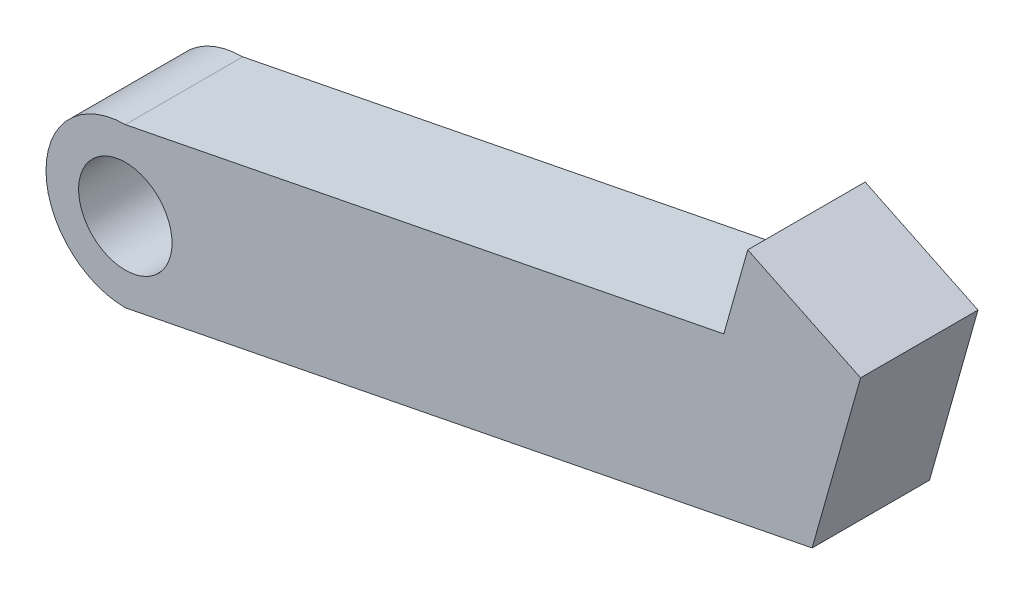
ISO-10303-21;
HEADER;
FILE_DESCRIPTION(('STEP AP214'),'2;1');
FILE_NAME('part.step','',(''),(''),'','','');
FILE_SCHEMA(('AUTOMOTIVE_DESIGN { 1 0 10303 214 1 1 1 1 }'));
ENDSEC;
DATA;
#1=APPLICATION_CONTEXT('core data for automotive mechanical design processes');
#2=APPLICATION_PROTOCOL_DEFINITION('international standard','automotive_design',2000,#1);
#3=PRODUCT_CONTEXT('',#1,'mechanical');
#4=PRODUCT('Part','Part','',(#3));
#5=PRODUCT_RELATED_PRODUCT_CATEGORY('part','',(#4));
#6=PRODUCT_DEFINITION_FORMATION('','',#4);
#7=PRODUCT_DEFINITION_CONTEXT('part definition',#1,'design');
#8=PRODUCT_DEFINITION('design','',#6,#7);
#9=PRODUCT_DEFINITION_SHAPE('','',#8);
#10=(LENGTH_UNIT() NAMED_UNIT(*) SI_UNIT(.MILLI.,.METRE.));
#11=(NAMED_UNIT(*) PLANE_ANGLE_UNIT() SI_UNIT($,.RADIAN.));
#12=(NAMED_UNIT(*) SI_UNIT($,.STERADIAN.) SOLID_ANGLE_UNIT());
#13=UNCERTAINTY_MEASURE_WITH_UNIT(LENGTH_MEASURE(1.E-05),#10,'distance_accuracy_value','');
#14=(GEOMETRIC_REPRESENTATION_CONTEXT(3) GLOBAL_UNCERTAINTY_ASSIGNED_CONTEXT((#13)) GLOBAL_UNIT_ASSIGNED_CONTEXT((#10,
#11,#12)) REPRESENTATION_CONTEXT('',''));
#15=CARTESIAN_POINT('',(0.,0.,0.));
#16=DIRECTION('',(0.,0.,1.));
#17=DIRECTION('',(1.,0.,0.));
#18=AXIS2_PLACEMENT_3D('',#15,#16,#17);
#19=CARTESIAN_POINT('',(0.,0.,8.4582));
#20=DIRECTION('',(0.,0.,1.));
#21=DIRECTION('',(1.,0.,0.));
#22=AXIS2_PLACEMENT_3D('',#19,#20,#21);
#23=PLANE('',#22);
#24=CARTESIAN_POINT('',(0.,0.,8.4582));
#25=DIRECTION('',(0.,0.,1.));
#26=DIRECTION('',(1.,0.,0.));
#27=AXIS2_PLACEMENT_3D('',#24,#25,#26);
#28=CIRCLE('',#27,5.715);
#29=CARTESIAN_POINT('',(0.,5.715,8.4582));
#30=VERTEX_POINT('',#29);
#31=CARTESIAN_POINT('',(0.,-5.715,8.4582));
#32=VERTEX_POINT('',#31);
#33=EDGE_CURVE('E132',#30,#32,#28,.T.);
#34=ORIENTED_EDGE('',*,*,#33,.T.);
#35=DIRECTION('',(0.981117950795987,0.19341035811425,0.));
#36=VECTOR('',#35,1.);
#37=CARTESIAN_POINT('',(0.,-5.715,8.4582));
#38=LINE('',#37,#36);
#39=CARTESIAN_POINT('',(49.4787550605834,4.03887691923356,8.4582));
#40=VERTEX_POINT('',#39);
#41=EDGE_CURVE('E90',#32,#40,#38,.T.);
#42=ORIENTED_EDGE('',*,*,#41,.T.);
#43=DIRECTION('',(0.271849514236705,0.962339774512759,0.));
#44=VECTOR('',#43,1.);
#45=CARTESIAN_POINT('',(49.4787550605834,4.03887691923356,8.4582));
#46=LINE('',#45,#44);
#47=CARTESIAN_POINT('',(52.9706364381287,16.4000405833564,8.4582));
#48=VERTEX_POINT('',#47);
#49=EDGE_CURVE('E103',#40,#48,#46,.T.);
#50=ORIENTED_EDGE('',*,*,#49,.T.);
#51=DIRECTION('',(-0.900513498225339,0.434828057413458,0.));
#52=VECTOR('',#51,1.);
#53=CARTESIAN_POINT('',(52.9706364381287,16.4000405833564,8.4582));
#54=LINE('',#53,#52);
#55=CARTESIAN_POINT('',(44.8415726947363,20.3252954552662,8.4582));
#56=VERTEX_POINT('',#55);
#57=EDGE_CURVE('E97',#48,#56,#54,.T.);
#58=ORIENTED_EDGE('',*,*,#57,.T.);
#59=DIRECTION('',(-0.271849514236705,-0.962339774512759,0.));
#60=VECTOR('',#59,1.);
#61=CARTESIAN_POINT('',(44.8415726947363,20.3252954552662,8.4582));
#62=LINE('',#61,#60);
#63=CARTESIAN_POINT('',(43.1153282793332,14.2144378871102,8.4582));
#64=VERTEX_POINT('',#63);
#65=EDGE_CURVE('E101',#56,#64,#62,.T.);
#66=ORIENTED_EDGE('',*,*,#65,.T.);
#67=DIRECTION('',(-0.981117950795987,-0.19341035811425,0.));
#68=VECTOR('',#67,1.);
#69=CARTESIAN_POINT('',(43.1153282793332,14.2144378871102,8.4582));
#70=LINE('',#69,#68);
#71=EDGE_CURVE('E53',#64,#30,#70,.T.);
#72=ORIENTED_EDGE('',*,*,#71,.T.);
#73=EDGE_LOOP('',(#34,#42,#50,#58,#66,#72));
#74=FACE_BOUND('',#73,.T.);
#75=CARTESIAN_POINT('',(0.,0.,8.4582));
#76=DIRECTION('',(0.,0.,1.));
#77=DIRECTION('',(1.,0.,0.));
#78=AXIS2_PLACEMENT_3D('',#75,#76,#77);
#79=CIRCLE('',#78,3.3655);
#80=CARTESIAN_POINT('',(3.3655,0.,8.4582));
#81=VERTEX_POINT('',#80);
#82=EDGE_CURVE('E125',#81,#81,#79,.T.);
#83=ORIENTED_EDGE('',*,*,#82,.F.);
#84=EDGE_LOOP('',(#83));
#85=FACE_BOUND('',#84,.T.);
#86=ADVANCED_FACE('F36',(#74,#85),#23,.T.);
#87=CARTESIAN_POINT('',(0.,0.,0.));
#88=DIRECTION('',(0.,0.,1.));
#89=DIRECTION('',(1.,0.,0.));
#90=AXIS2_PLACEMENT_3D('',#87,#88,#89);
#91=PLANE('',#90);
#92=CARTESIAN_POINT('',(0.,0.,0.));
#93=DIRECTION('',(0.,0.,1.));
#94=DIRECTION('',(1.,0.,0.));
#95=AXIS2_PLACEMENT_3D('',#92,#93,#94);
#96=CIRCLE('',#95,5.715);
#97=CARTESIAN_POINT('',(0.,5.715,0.));
#98=VERTEX_POINT('',#97);
#99=CARTESIAN_POINT('',(0.,-5.715,0.));
#100=VERTEX_POINT('',#99);
#101=EDGE_CURVE('E121',#98,#100,#96,.T.);
#102=ORIENTED_EDGE('',*,*,#101,.F.);
#103=DIRECTION('',(-0.981117950795987,-0.19341035811425,0.));
#104=VECTOR('',#103,1.);
#105=CARTESIAN_POINT('',(43.1153282793332,14.2144378871102,0.));
#106=LINE('',#105,#104);
#107=CARTESIAN_POINT('',(43.1153282793332,14.2144378871102,0.));
#108=VERTEX_POINT('',#107);
#109=EDGE_CURVE('E82',#108,#98,#106,.T.);
#110=ORIENTED_EDGE('',*,*,#109,.F.);
#111=DIRECTION('',(-0.271849514236705,-0.962339774512759,0.));
#112=VECTOR('',#111,1.);
#113=CARTESIAN_POINT('',(44.8415726947363,20.3252954552662,0.));
#114=LINE('',#113,#112);
#115=CARTESIAN_POINT('',(44.8415726947363,20.3252954552662,0.));
#116=VERTEX_POINT('',#115);
#117=EDGE_CURVE('E76',#116,#108,#114,.T.);
#118=ORIENTED_EDGE('',*,*,#117,.F.);
#119=DIRECTION('',(-0.900513498225339,0.434828057413458,0.));
#120=VECTOR('',#119,1.);
#121=CARTESIAN_POINT('',(52.9706364381287,16.4000405833564,0.));
#122=LINE('',#121,#120);
#123=CARTESIAN_POINT('',(52.9706364381287,16.4000405833564,0.));
#124=VERTEX_POINT('',#123);
#125=EDGE_CURVE('E111',#124,#116,#122,.T.);
#126=ORIENTED_EDGE('',*,*,#125,.F.);
#127=DIRECTION('',(0.271849514236705,0.962339774512759,0.));
#128=VECTOR('',#127,1.);
#129=CARTESIAN_POINT('',(49.4787550605834,4.03887691923356,0.));
#130=LINE('',#129,#128);
#131=CARTESIAN_POINT('',(49.4787550605834,4.03887691923356,0.));
#132=VERTEX_POINT('',#131);
#133=EDGE_CURVE('E127',#132,#124,#130,.T.);
#134=ORIENTED_EDGE('',*,*,#133,.F.);
#135=DIRECTION('',(0.981117950795987,0.19341035811425,0.));
#136=VECTOR('',#135,1.);
#137=CARTESIAN_POINT('',(0.,-5.715,0.));
#138=LINE('',#137,#136);
#139=EDGE_CURVE('E124',#100,#132,#138,.T.);
#140=ORIENTED_EDGE('',*,*,#139,.F.);
#141=EDGE_LOOP('',(#102,#110,#118,#126,#134,#140));
#142=FACE_BOUND('',#141,.T.);
#143=CARTESIAN_POINT('',(0.,0.,0.));
#144=DIRECTION('',(0.,0.,1.));
#145=DIRECTION('',(1.,0.,0.));
#146=AXIS2_PLACEMENT_3D('',#143,#144,#145);
#147=CIRCLE('',#146,3.3655);
#148=CARTESIAN_POINT('',(3.3655,0.,0.));
#149=VERTEX_POINT('',#148);
#150=EDGE_CURVE('E225',#149,#149,#147,.T.);
#151=ORIENTED_EDGE('',*,*,#150,.T.);
#152=EDGE_LOOP('',(#151));
#153=FACE_BOUND('',#152,.T.);
#154=ADVANCED_FACE('F141',(#142,#153),#91,.F.);
#155=CARTESIAN_POINT('',(0.,0.,8.4582));
#156=DIRECTION('',(0.,0.,-1.));
#157=DIRECTION('',(-1.,0.,0.));
#158=AXIS2_PLACEMENT_3D('',#155,#156,#157);
#159=CYLINDRICAL_SURFACE('',#158,5.715);
#160=ORIENTED_EDGE('',*,*,#101,.T.);
#161=DIRECTION('',(0.,0.,-1.));
#162=VECTOR('',#161,1.);
#163=CARTESIAN_POINT('',(0.,-5.715,8.4582));
#164=LINE('',#163,#162);
#165=EDGE_CURVE('E11',#32,#100,#164,.T.);
#166=ORIENTED_EDGE('',*,*,#165,.F.);
#167=ORIENTED_EDGE('',*,*,#33,.F.);
#168=DIRECTION('',(0.,0.,-1.));
#169=VECTOR('',#168,1.);
#170=CARTESIAN_POINT('',(0.,5.715,8.4582));
#171=LINE('',#170,#169);
#172=EDGE_CURVE('E117',#30,#98,#171,.T.);
#173=ORIENTED_EDGE('',*,*,#172,.T.);
#174=EDGE_LOOP('',(#160,#166,#167,#173));
#175=FACE_BOUND('',#174,.T.);
#176=ADVANCED_FACE('F38',(#175),#159,.T.);
#177=CARTESIAN_POINT('',(0.,-5.715,8.4582));
#178=DIRECTION('',(-0.19341035811425,0.981117950795987,0.));
#179=DIRECTION('',(-0.981117950795987,-0.19341035811425,0.));
#180=AXIS2_PLACEMENT_3D('',#177,#178,#179);
#181=PLANE('',#180);
#182=ORIENTED_EDGE('',*,*,#139,.T.);
#183=DIRECTION('',(0.,0.,-1.));
#184=VECTOR('',#183,1.);
#185=CARTESIAN_POINT('',(49.4787550605834,4.03887691923356,8.4582));
#186=LINE('',#185,#184);
#187=EDGE_CURVE('E45',#40,#132,#186,.T.);
#188=ORIENTED_EDGE('',*,*,#187,.F.);
#189=ORIENTED_EDGE('',*,*,#41,.F.);
#190=ORIENTED_EDGE('',*,*,#165,.T.);
#191=EDGE_LOOP('',(#182,#188,#189,#190));
#192=FACE_BOUND('',#191,.T.);
#193=ADVANCED_FACE('F166',(#192),#181,.F.);
#194=CARTESIAN_POINT('',(49.4787550605834,4.03887691923356,8.4582));
#195=DIRECTION('',(-0.962339774512759,0.271849514236705,0.));
#196=DIRECTION('',(-0.271849514236705,-0.962339774512759,0.));
#197=AXIS2_PLACEMENT_3D('',#194,#195,#196);
#198=PLANE('',#197);
#199=ORIENTED_EDGE('',*,*,#133,.T.);
#200=DIRECTION('',(0.,0.,-1.));
#201=VECTOR('',#200,1.);
#202=CARTESIAN_POINT('',(52.9706364381287,16.4000405833564,8.4582));
#203=LINE('',#202,#201);
#204=EDGE_CURVE('E112',#48,#124,#203,.T.);
#205=ORIENTED_EDGE('',*,*,#204,.F.);
#206=ORIENTED_EDGE('',*,*,#49,.F.);
#207=ORIENTED_EDGE('',*,*,#187,.T.);
#208=EDGE_LOOP('',(#199,#205,#206,#207));
#209=FACE_BOUND('',#208,.T.);
#210=ADVANCED_FACE('F138',(#209),#198,.F.);
#211=CARTESIAN_POINT('',(52.9706364381287,16.4000405833564,8.4582));
#212=DIRECTION('',(-0.434828057413458,-0.900513498225339,0.));
#213=DIRECTION('',(0.900513498225339,-0.434828057413458,0.));
#214=AXIS2_PLACEMENT_3D('',#211,#212,#213);
#215=PLANE('',#214);
#216=ORIENTED_EDGE('',*,*,#125,.T.);
#217=DIRECTION('',(0.,0.,-1.));
#218=VECTOR('',#217,1.);
#219=CARTESIAN_POINT('',(44.8415726947363,20.3252954552662,8.4582));
#220=LINE('',#219,#218);
#221=EDGE_CURVE('E108',#56,#116,#220,.T.);
#222=ORIENTED_EDGE('',*,*,#221,.F.);
#223=ORIENTED_EDGE('',*,*,#57,.F.);
#224=ORIENTED_EDGE('',*,*,#204,.T.);
#225=EDGE_LOOP('',(#216,#222,#223,#224));
#226=FACE_BOUND('',#225,.T.);
#227=ADVANCED_FACE('F109',(#226),#215,.F.);
#228=CARTESIAN_POINT('',(44.8415726947363,20.3252954552662,8.4582));
#229=DIRECTION('',(0.962339774512759,-0.271849514236705,0.));
#230=DIRECTION('',(0.271849514236705,0.962339774512759,0.));
#231=AXIS2_PLACEMENT_3D('',#228,#229,#230);
#232=PLANE('',#231);
#233=ORIENTED_EDGE('',*,*,#117,.T.);
#234=DIRECTION('',(0.,0.,-1.));
#235=VECTOR('',#234,1.);
#236=CARTESIAN_POINT('',(43.1153282793332,14.2144378871102,8.4582));
#237=LINE('',#236,#235);
#238=EDGE_CURVE('E113',#64,#108,#237,.T.);
#239=ORIENTED_EDGE('',*,*,#238,.F.);
#240=ORIENTED_EDGE('',*,*,#65,.F.);
#241=ORIENTED_EDGE('',*,*,#221,.T.);
#242=EDGE_LOOP('',(#233,#239,#240,#241));
#243=FACE_BOUND('',#242,.T.);
#244=ADVANCED_FACE('F115',(#243),#232,.F.);
#245=CARTESIAN_POINT('',(43.1153282793332,14.2144378871102,8.4582));
#246=DIRECTION('',(0.19341035811425,-0.981117950795987,0.));
#247=DIRECTION('',(0.981117950795987,0.19341035811425,0.));
#248=AXIS2_PLACEMENT_3D('',#245,#246,#247);
#249=PLANE('',#248);
#250=ORIENTED_EDGE('',*,*,#109,.T.);
#251=ORIENTED_EDGE('',*,*,#172,.F.);
#252=ORIENTED_EDGE('',*,*,#71,.F.);
#253=ORIENTED_EDGE('',*,*,#238,.T.);
#254=EDGE_LOOP('',(#250,#251,#252,#253));
#255=FACE_BOUND('',#254,.T.);
#256=ADVANCED_FACE('F146',(#255),#249,.F.);
#257=CARTESIAN_POINT('',(0.,0.,8.4582));
#258=DIRECTION('',(0.,0.,-1.));
#259=DIRECTION('',(-1.,0.,0.));
#260=AXIS2_PLACEMENT_3D('',#257,#258,#259);
#261=CYLINDRICAL_SURFACE('',#260,3.3655);
#262=ORIENTED_EDGE('',*,*,#82,.T.);
#263=EDGE_LOOP('',(#262));
#264=FACE_BOUND('',#263,.T.);
#265=ORIENTED_EDGE('',*,*,#150,.F.);
#266=EDGE_LOOP('',(#265));
#267=FACE_BOUND('',#266,.T.);
#268=ADVANCED_FACE('F148',(#264,#267),#261,.F.);
#269=CLOSED_SHELL('',(#86,#154,#176,#193,#210,#227,#244,#256,#268));
#270=MANIFOLD_SOLID_BREP('B2',#269);
#271=ADVANCED_BREP_SHAPE_REPRESENTATION('',(#18,#270),#14);
#272=SHAPE_DEFINITION_REPRESENTATION(#9,#271);
ENDSEC;
END-ISO-10303-21;
